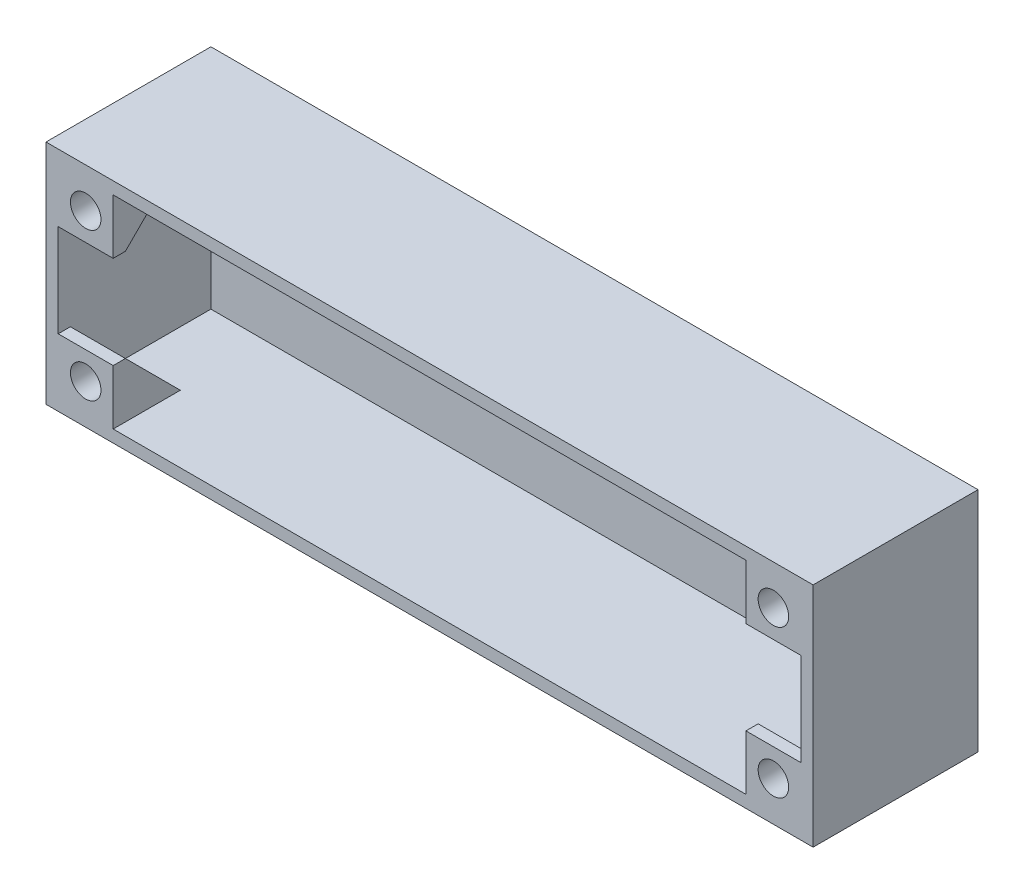
ISO-10303-21;
HEADER;
FILE_DESCRIPTION(('STEP AP214'),'2;1');
FILE_NAME('part.step','',(''),(''),'','','');
FILE_SCHEMA(('AUTOMOTIVE_DESIGN { 1 0 10303 214 1 1 1 1 }'));
ENDSEC;
DATA;
#1=APPLICATION_CONTEXT('core data for automotive mechanical design processes');
#2=APPLICATION_PROTOCOL_DEFINITION('international standard','automotive_design',2000,#1);
#3=PRODUCT_CONTEXT('',#1,'mechanical');
#4=PRODUCT('Part','Part','',(#3));
#5=PRODUCT_RELATED_PRODUCT_CATEGORY('part','',(#4));
#6=PRODUCT_DEFINITION_FORMATION('','',#4);
#7=PRODUCT_DEFINITION_CONTEXT('part definition',#1,'design');
#8=PRODUCT_DEFINITION('design','',#6,#7);
#9=PRODUCT_DEFINITION_SHAPE('','',#8);
#10=(LENGTH_UNIT() NAMED_UNIT(*) SI_UNIT(.MILLI.,.METRE.));
#11=(NAMED_UNIT(*) PLANE_ANGLE_UNIT() SI_UNIT($,.RADIAN.));
#12=(NAMED_UNIT(*) SI_UNIT($,.STERADIAN.) SOLID_ANGLE_UNIT());
#13=UNCERTAINTY_MEASURE_WITH_UNIT(LENGTH_MEASURE(1.E-05),#10,'distance_accuracy_value','');
#14=(GEOMETRIC_REPRESENTATION_CONTEXT(3) GLOBAL_UNCERTAINTY_ASSIGNED_CONTEXT((#13)) GLOBAL_UNIT_ASSIGNED_CONTEXT((#10,
#11,#12)) REPRESENTATION_CONTEXT('',''));
#15=CARTESIAN_POINT('',(0.,0.,0.));
#16=DIRECTION('',(0.,0.,1.));
#17=DIRECTION('',(1.,0.,0.));
#18=AXIS2_PLACEMENT_3D('',#15,#16,#17);
#19=CARTESIAN_POINT('',(0.,0.,-81.3976969654658));
#20=DIRECTION('',(0.,0.,-1.));
#21=DIRECTION('',(-1.,0.,0.));
#22=AXIS2_PLACEMENT_3D('',#19,#20,#21);
#23=PLANE('',#22);
#24=CARTESIAN_POINT('',(90.9030782776469,105.238059859203,-81.3976969654658));
#25=DIRECTION('',(0.,0.,1.));
#26=DIRECTION('',(1.,0.,0.));
#27=AXIS2_PLACEMENT_3D('',#24,#25,#26);
#28=CIRCLE('',#27,2.50000000000001);
#29=CARTESIAN_POINT('',(93.4030782776469,105.238059859203,-81.3976969654658));
#30=VERTEX_POINT('',#29);
#31=EDGE_CURVE('E725',#30,#30,#28,.T.);
#32=ORIENTED_EDGE('',*,*,#31,.F.);
#33=EDGE_LOOP('',(#32));
#34=FACE_BOUND('',#33,.T.);
#35=CARTESIAN_POINT('',(90.9030782776469,81.0380598592033,-81.3976969654658));
#36=DIRECTION('',(0.,0.,1.));
#37=DIRECTION('',(1.,0.,0.));
#38=AXIS2_PLACEMENT_3D('',#35,#36,#37);
#39=CIRCLE('',#38,2.50000000000001);
#40=CARTESIAN_POINT('',(93.4030782776469,81.0380598592033,-81.3976969654658));
#41=VERTEX_POINT('',#40);
#42=EDGE_CURVE('E727',#41,#41,#39,.T.);
#43=ORIENTED_EDGE('',*,*,#42,.F.);
#44=EDGE_LOOP('',(#43));
#45=FACE_BOUND('',#44,.T.);
#46=CARTESIAN_POINT('',(-21.6969217223531,81.0380598592034,-81.3976969654658));
#47=DIRECTION('',(0.,0.,1.));
#48=DIRECTION('',(1.,0.,0.));
#49=AXIS2_PLACEMENT_3D('',#46,#47,#48);
#50=CIRCLE('',#49,2.5);
#51=CARTESIAN_POINT('',(-19.1969217223531,81.0380598592034,-81.3976969654658));
#52=VERTEX_POINT('',#51);
#53=EDGE_CURVE('E730',#52,#52,#50,.T.);
#54=ORIENTED_EDGE('',*,*,#53,.F.);
#55=EDGE_LOOP('',(#54));
#56=FACE_BOUND('',#55,.T.);
#57=CARTESIAN_POINT('',(-21.6969217223531,105.238059859203,-81.3976969654658));
#58=DIRECTION('',(0.,0.,1.));
#59=DIRECTION('',(1.,0.,0.));
#60=AXIS2_PLACEMENT_3D('',#57,#58,#59);
#61=CIRCLE('',#60,2.5);
#62=CARTESIAN_POINT('',(-19.1969217223531,105.238059859203,-81.3976969654658));
#63=VERTEX_POINT('',#62);
#64=EDGE_CURVE('E220',#63,#63,#61,.T.);
#65=ORIENTED_EDGE('',*,*,#64,.F.);
#66=EDGE_LOOP('',(#65));
#67=FACE_BOUND('',#66,.T.);
#68=DIRECTION('',(-1.,0.,0.));
#69=VECTOR('',#68,1.);
#70=CARTESIAN_POINT('',(-26.1969217223531,76.5380598592034,-81.3976969654658));
#71=LINE('',#70,#69);
#72=CARTESIAN_POINT('',(86.4030782776469,76.5380598592034,-81.3976969654658));
#73=VERTEX_POINT('',#72);
#74=CARTESIAN_POINT('',(-17.1969217223531,76.5380598592034,-81.3976969654658));
#75=VERTEX_POINT('',#74);
#76=EDGE_CURVE('E303',#73,#75,#71,.T.);
#77=ORIENTED_EDGE('',*,*,#76,.T.);
#78=DIRECTION('',(0.,1.,0.));
#79=VECTOR('',#78,1.);
#80=CARTESIAN_POINT('',(-17.1969217223531,76.5380598592034,-81.3976969654658));
#81=LINE('',#80,#79);
#82=CARTESIAN_POINT('',(-17.1969217223531,85.5380598592034,-81.3976969654658));
#83=VERTEX_POINT('',#82);
#84=EDGE_CURVE('E216',#75,#83,#81,.T.);
#85=ORIENTED_EDGE('',*,*,#84,.T.);
#86=DIRECTION('',(-1.,0.,0.));
#87=VECTOR('',#86,1.);
#88=CARTESIAN_POINT('',(-26.1969217223531,85.5380598592034,-81.3976969654658));
#89=LINE('',#88,#87);
#90=CARTESIAN_POINT('',(-26.1969217223531,85.5380598592034,-81.3976969654658));
#91=VERTEX_POINT('',#90);
#92=EDGE_CURVE('E204',#83,#91,#89,.T.);
#93=ORIENTED_EDGE('',*,*,#92,.T.);
#94=DIRECTION('',(0.,1.,0.));
#95=VECTOR('',#94,1.);
#96=CARTESIAN_POINT('',(-26.1969217223531,76.5380598592034,-81.3976969654658));
#97=LINE('',#96,#95);
#98=CARTESIAN_POINT('',(-26.1969217223531,100.738059859203,-81.3976969654658));
#99=VERTEX_POINT('',#98);
#100=EDGE_CURVE('E325',#91,#99,#97,.T.);
#101=ORIENTED_EDGE('',*,*,#100,.T.);
#102=DIRECTION('',(1.,0.,0.));
#103=VECTOR('',#102,1.);
#104=CARTESIAN_POINT('',(-26.1969217223531,100.738059859203,-81.3976969654658));
#105=LINE('',#104,#103);
#106=CARTESIAN_POINT('',(-17.1969217223531,100.738059859203,-81.3976969654658));
#107=VERTEX_POINT('',#106);
#108=EDGE_CURVE('E225',#99,#107,#105,.T.);
#109=ORIENTED_EDGE('',*,*,#108,.T.);
#110=DIRECTION('',(0.,1.,0.));
#111=VECTOR('',#110,1.);
#112=CARTESIAN_POINT('',(-17.1969217223531,109.738059859203,-81.3976969654658));
#113=LINE('',#112,#111);
#114=CARTESIAN_POINT('',(-17.1969217223531,109.738059859203,-81.3976969654658));
#115=VERTEX_POINT('',#114);
#116=EDGE_CURVE('E232',#107,#115,#113,.T.);
#117=ORIENTED_EDGE('',*,*,#116,.T.);
#118=DIRECTION('',(1.,0.,0.));
#119=VECTOR('',#118,1.);
#120=CARTESIAN_POINT('',(-26.1969217223531,109.738059859203,-81.3976969654658));
#121=LINE('',#120,#119);
#122=CARTESIAN_POINT('',(86.4030782776469,109.738059859203,-81.3976969654658));
#123=VERTEX_POINT('',#122);
#124=EDGE_CURVE('E328',#115,#123,#121,.T.);
#125=ORIENTED_EDGE('',*,*,#124,.T.);
#126=DIRECTION('',(0.,-1.,0.));
#127=VECTOR('',#126,1.);
#128=CARTESIAN_POINT('',(86.4030782776469,109.738059859203,-81.3976969654658));
#129=LINE('',#128,#127);
#130=CARTESIAN_POINT('',(86.4030782776469,100.738059859203,-81.3976969654658));
#131=VERTEX_POINT('',#130);
#132=EDGE_CURVE('E262',#123,#131,#129,.T.);
#133=ORIENTED_EDGE('',*,*,#132,.T.);
#134=DIRECTION('',(1.,0.,0.));
#135=VECTOR('',#134,1.);
#136=CARTESIAN_POINT('',(95.4030782776469,100.738059859203,-81.3976969654658));
#137=LINE('',#136,#135);
#138=CARTESIAN_POINT('',(95.4030782776469,100.738059859203,-81.3976969654658));
#139=VERTEX_POINT('',#138);
#140=EDGE_CURVE('E272',#131,#139,#137,.T.);
#141=ORIENTED_EDGE('',*,*,#140,.T.);
#142=DIRECTION('',(0.,-1.,0.));
#143=VECTOR('',#142,1.);
#144=CARTESIAN_POINT('',(95.4030782776469,76.5380598592034,-81.3976969654658));
#145=LINE('',#144,#143);
#146=CARTESIAN_POINT('',(95.4030782776469,85.5380598592033,-81.3976969654658));
#147=VERTEX_POINT('',#146);
#148=EDGE_CURVE('E309',#139,#147,#145,.T.);
#149=ORIENTED_EDGE('',*,*,#148,.T.);
#150=DIRECTION('',(-1.,0.,0.));
#151=VECTOR('',#150,1.);
#152=CARTESIAN_POINT('',(95.4030782776469,85.5380598592033,-81.3976969654658));
#153=LINE('',#152,#151);
#154=CARTESIAN_POINT('',(86.4030782776469,85.5380598592033,-81.3976969654658));
#155=VERTEX_POINT('',#154);
#156=EDGE_CURVE('E240',#147,#155,#153,.T.);
#157=ORIENTED_EDGE('',*,*,#156,.T.);
#158=DIRECTION('',(0.,-1.,0.));
#159=VECTOR('',#158,1.);
#160=CARTESIAN_POINT('',(86.4030782776469,76.5380598592034,-81.3976969654658));
#161=LINE('',#160,#159);
#162=EDGE_CURVE('E252',#155,#73,#161,.T.);
#163=ORIENTED_EDGE('',*,*,#162,.T.);
#164=EDGE_LOOP('',(#77,#85,#93,#101,#109,#117,#125,#133,#141,#149,#157,#163));
#165=FACE_BOUND('',#164,.T.);
#166=DIRECTION('',(0.,1.,0.));
#167=VECTOR('',#166,1.);
#168=CARTESIAN_POINT('',(-28.1969217223531,74.5380598592034,-81.3976969654658));
#169=LINE('',#168,#167);
#170=CARTESIAN_POINT('',(-28.1969217223531,74.5380598592034,-81.3976969654658));
#171=VERTEX_POINT('',#170);
#172=CARTESIAN_POINT('',(-28.1969217223531,111.738059859203,-81.3976969654658));
#173=VERTEX_POINT('',#172);
#174=EDGE_CURVE('E349',#171,#173,#169,.T.);
#175=ORIENTED_EDGE('',*,*,#174,.F.);
#176=DIRECTION('',(-1.,0.,0.));
#177=VECTOR('',#176,1.);
#178=CARTESIAN_POINT('',(-28.1969217223531,74.5380598592034,-81.3976969654658));
#179=LINE('',#178,#177);
#180=CARTESIAN_POINT('',(97.4030782776469,74.5380598592034,-81.3976969654658));
#181=VERTEX_POINT('',#180);
#182=EDGE_CURVE('E359',#181,#171,#179,.T.);
#183=ORIENTED_EDGE('',*,*,#182,.F.);
#184=DIRECTION('',(0.,-1.,0.));
#185=VECTOR('',#184,1.);
#186=CARTESIAN_POINT('',(97.4030782776469,74.5380598592034,-81.3976969654658));
#187=LINE('',#186,#185);
#188=CARTESIAN_POINT('',(97.4030782776469,111.738059859203,-81.3976969654658));
#189=VERTEX_POINT('',#188);
#190=EDGE_CURVE('E356',#189,#181,#187,.T.);
#191=ORIENTED_EDGE('',*,*,#190,.F.);
#192=DIRECTION('',(1.,0.,0.));
#193=VECTOR('',#192,1.);
#194=CARTESIAN_POINT('',(-28.1969217223531,111.738059859203,-81.3976969654658));
#195=LINE('',#194,#193);
#196=EDGE_CURVE('E353',#173,#189,#195,.T.);
#197=ORIENTED_EDGE('',*,*,#196,.F.);
#198=EDGE_LOOP('',(#175,#183,#191,#197));
#199=FACE_BOUND('',#198,.T.);
#200=ADVANCED_FACE('F41',(#34,#45,#56,#67,#165,#199),#23,.F.);
#201=CARTESIAN_POINT('',(-28.1969217223531,74.5380598592034,-106.397696965466));
#202=DIRECTION('',(1.,0.,0.));
#203=DIRECTION('',(0.,0.,-1.));
#204=AXIS2_PLACEMENT_3D('',#201,#202,#203);
#205=PLANE('',#204);
#206=ORIENTED_EDGE('',*,*,#174,.T.);
#207=DIRECTION('',(0.,0.,1.));
#208=VECTOR('',#207,1.);
#209=CARTESIAN_POINT('',(-28.1969217223531,111.738059859203,-106.397696965466));
#210=LINE('',#209,#208);
#211=CARTESIAN_POINT('',(-28.1969217223531,111.738059859203,-108.397696965466));
#212=VERTEX_POINT('',#211);
#213=EDGE_CURVE('E374',#212,#173,#210,.T.);
#214=ORIENTED_EDGE('',*,*,#213,.F.);
#215=DIRECTION('',(0.,1.,0.));
#216=VECTOR('',#215,1.);
#217=CARTESIAN_POINT('',(-28.1969217223531,74.5380598592034,-108.397696965466));
#218=LINE('',#217,#216);
#219=CARTESIAN_POINT('',(-28.1969217223531,74.5380598592034,-108.397696965466));
#220=VERTEX_POINT('',#219);
#221=EDGE_CURVE('E295',#220,#212,#218,.T.);
#222=ORIENTED_EDGE('',*,*,#221,.F.);
#223=DIRECTION('',(0.,0.,1.));
#224=VECTOR('',#223,1.);
#225=CARTESIAN_POINT('',(-28.1969217223531,74.5380598592034,-106.397696965466));
#226=LINE('',#225,#224);
#227=EDGE_CURVE('E362',#220,#171,#226,.T.);
#228=ORIENTED_EDGE('',*,*,#227,.T.);
#229=EDGE_LOOP('',(#206,#214,#222,#228));
#230=FACE_BOUND('',#229,.T.);
#231=ADVANCED_FACE('F437',(#230),#205,.F.);
#232=CARTESIAN_POINT('',(-28.1969217223531,111.738059859203,-106.397696965466));
#233=DIRECTION('',(0.,-1.,0.));
#234=DIRECTION('',(1.,0.,0.));
#235=AXIS2_PLACEMENT_3D('',#232,#233,#234);
#236=PLANE('',#235);
#237=ORIENTED_EDGE('',*,*,#196,.T.);
#238=DIRECTION('',(0.,0.,1.));
#239=VECTOR('',#238,1.);
#240=CARTESIAN_POINT('',(97.4030782776469,111.738059859203,-106.397696965466));
#241=LINE('',#240,#239);
#242=CARTESIAN_POINT('',(97.4030782776469,111.738059859203,-108.397696965466));
#243=VERTEX_POINT('',#242);
#244=EDGE_CURVE('E370',#243,#189,#241,.T.);
#245=ORIENTED_EDGE('',*,*,#244,.F.);
#246=DIRECTION('',(1.,0.,0.));
#247=VECTOR('',#246,1.);
#248=CARTESIAN_POINT('',(97.4030782776469,111.738059859203,-108.397696965466));
#249=LINE('',#248,#247);
#250=EDGE_CURVE('E299',#212,#243,#249,.T.);
#251=ORIENTED_EDGE('',*,*,#250,.F.);
#252=ORIENTED_EDGE('',*,*,#213,.T.);
#253=EDGE_LOOP('',(#237,#245,#251,#252));
#254=FACE_BOUND('',#253,.T.);
#255=ADVANCED_FACE('F443',(#254),#236,.F.);
#256=CARTESIAN_POINT('',(97.4030782776469,74.5380598592034,-106.397696965466));
#257=DIRECTION('',(-1.,0.,0.));
#258=DIRECTION('',(0.,0.,1.));
#259=AXIS2_PLACEMENT_3D('',#256,#257,#258);
#260=PLANE('',#259);
#261=ORIENTED_EDGE('',*,*,#190,.T.);
#262=DIRECTION('',(0.,0.,1.));
#263=VECTOR('',#262,1.);
#264=CARTESIAN_POINT('',(97.4030782776469,74.5380598592034,-106.397696965466));
#265=LINE('',#264,#263);
#266=CARTESIAN_POINT('',(97.4030782776469,74.5380598592034,-108.397696965466));
#267=VERTEX_POINT('',#266);
#268=EDGE_CURVE('E366',#267,#181,#265,.T.);
#269=ORIENTED_EDGE('',*,*,#268,.F.);
#270=DIRECTION('',(0.,-1.,0.));
#271=VECTOR('',#270,1.);
#272=CARTESIAN_POINT('',(97.4030782776469,74.5380598592034,-108.397696965466));
#273=LINE('',#272,#271);
#274=EDGE_CURVE('E282',#243,#267,#273,.T.);
#275=ORIENTED_EDGE('',*,*,#274,.F.);
#276=ORIENTED_EDGE('',*,*,#244,.T.);
#277=EDGE_LOOP('',(#261,#269,#275,#276));
#278=FACE_BOUND('',#277,.T.);
#279=ADVANCED_FACE('F455',(#278),#260,.F.);
#280=CARTESIAN_POINT('',(-28.1969217223531,74.5380598592034,-106.397696965466));
#281=DIRECTION('',(0.,1.,0.));
#282=DIRECTION('',(-1.,0.,0.));
#283=AXIS2_PLACEMENT_3D('',#280,#281,#282);
#284=PLANE('',#283);
#285=ORIENTED_EDGE('',*,*,#182,.T.);
#286=ORIENTED_EDGE('',*,*,#227,.F.);
#287=DIRECTION('',(-1.,0.,0.));
#288=VECTOR('',#287,1.);
#289=CARTESIAN_POINT('',(97.4030782776469,74.5380598592034,-108.397696965466));
#290=LINE('',#289,#288);
#291=EDGE_CURVE('E291',#267,#220,#290,.T.);
#292=ORIENTED_EDGE('',*,*,#291,.F.);
#293=ORIENTED_EDGE('',*,*,#268,.T.);
#294=EDGE_LOOP('',(#285,#286,#292,#293));
#295=FACE_BOUND('',#294,.T.);
#296=ADVANCED_FACE('F452',(#295),#284,.F.);
#297=CARTESIAN_POINT('',(-26.1969217223531,76.5380598592034,-106.397696965466));
#298=DIRECTION('',(0.,1.,0.));
#299=DIRECTION('',(-1.,0.,0.));
#300=AXIS2_PLACEMENT_3D('',#297,#298,#299);
#301=PLANE('',#300);
#302=DIRECTION('',(0.,0.,1.));
#303=VECTOR('',#302,1.);
#304=CARTESIAN_POINT('',(-26.1969217223531,76.5380598592034,-106.397696965466));
#305=LINE('',#304,#303);
#306=CARTESIAN_POINT('',(-26.1969217223531,76.5380598592034,-106.397696965466));
#307=VERTEX_POINT('',#306);
#308=CARTESIAN_POINT('',(-26.1969217223531,76.5380598592034,-92.3976969654658));
#309=VERTEX_POINT('',#308);
#310=EDGE_CURVE('E345',#307,#309,#305,.T.);
#311=ORIENTED_EDGE('',*,*,#310,.T.);
#312=DIRECTION('',(1.,0.,0.));
#313=VECTOR('',#312,1.);
#314=CARTESIAN_POINT('',(-17.1969217223531,76.5380598592034,-92.3976969654658));
#315=LINE('',#314,#313);
#316=CARTESIAN_POINT('',(-17.1969217223531,76.5380598592034,-92.3976969654658));
#317=VERTEX_POINT('',#316);
#318=EDGE_CURVE('E382',#309,#317,#315,.T.);
#319=ORIENTED_EDGE('',*,*,#318,.T.);
#320=DIRECTION('',(0.,0.,1.));
#321=VECTOR('',#320,1.);
#322=CARTESIAN_POINT('',(-17.1969217223531,76.5380598592034,-83.3976969654658));
#323=LINE('',#322,#321);
#324=EDGE_CURVE('E189',#317,#75,#323,.T.);
#325=ORIENTED_EDGE('',*,*,#324,.T.);
#326=ORIENTED_EDGE('',*,*,#76,.F.);
#327=DIRECTION('',(0.,0.,1.));
#328=VECTOR('',#327,1.);
#329=CARTESIAN_POINT('',(86.4030782776469,76.5380598592034,-83.3976969654658));
#330=LINE('',#329,#328);
#331=CARTESIAN_POINT('',(86.4030782776469,76.5380598592034,-92.3976969654658));
#332=VERTEX_POINT('',#331);
#333=EDGE_CURVE('E259',#332,#73,#330,.T.);
#334=ORIENTED_EDGE('',*,*,#333,.F.);
#335=DIRECTION('',(1.,0.,0.));
#336=VECTOR('',#335,1.);
#337=CARTESIAN_POINT('',(-26.1969217223531,76.5380598592034,-92.3976969654658));
#338=LINE('',#337,#336);
#339=CARTESIAN_POINT('',(95.4030782776469,76.5380598592034,-92.3976969654658));
#340=VERTEX_POINT('',#339);
#341=EDGE_CURVE('E378',#332,#340,#338,.T.);
#342=ORIENTED_EDGE('',*,*,#341,.T.);
#343=DIRECTION('',(0.,0.,1.));
#344=VECTOR('',#343,1.);
#345=CARTESIAN_POINT('',(95.4030782776469,76.5380598592034,-106.397696965466));
#346=LINE('',#345,#344);
#347=CARTESIAN_POINT('',(95.4030782776469,76.5380598592034,-106.397696965466));
#348=VERTEX_POINT('',#347);
#349=EDGE_CURVE('E321',#348,#340,#346,.T.);
#350=ORIENTED_EDGE('',*,*,#349,.F.);
#351=DIRECTION('',(-1.,0.,0.));
#352=VECTOR('',#351,1.);
#353=CARTESIAN_POINT('',(-26.1969217223531,76.5380598592034,-106.397696965466));
#354=LINE('',#353,#352);
#355=EDGE_CURVE('E304',#348,#307,#354,.T.);
#356=ORIENTED_EDGE('',*,*,#355,.T.);
#357=EDGE_LOOP('',(#311,#319,#325,#326,#334,#342,#350,#356));
#358=FACE_BOUND('',#357,.T.);
#359=ADVANCED_FACE('F450',(#358),#301,.T.);
#360=CARTESIAN_POINT('',(-26.1969217223531,76.5380598592034,-106.397696965466));
#361=DIRECTION('',(1.,0.,0.));
#362=DIRECTION('',(0.,0.,-1.));
#363=AXIS2_PLACEMENT_3D('',#360,#361,#362);
#364=PLANE('',#363);
#365=DIRECTION('',(0.,0.,1.));
#366=VECTOR('',#365,1.);
#367=CARTESIAN_POINT('',(-26.1969217223531,85.5380598592034,-83.3976969654658));
#368=LINE('',#367,#366);
#369=CARTESIAN_POINT('',(-26.1969217223531,85.5380598592034,-83.3976969654658));
#370=VERTEX_POINT('',#369);
#371=EDGE_CURVE('E206',#370,#91,#368,.T.);
#372=ORIENTED_EDGE('',*,*,#371,.F.);
#373=DIRECTION('',(0.,0.707106781186544,0.707106781186551));
#374=VECTOR('',#373,1.);
#375=CARTESIAN_POINT('',(-26.1969217223531,69.5380598592034,-99.3976969654659));
#376=LINE('',#375,#374);
#377=EDGE_CURVE('E210',#370,#309,#376,.F.);
#378=ORIENTED_EDGE('',*,*,#377,.T.);
#379=ORIENTED_EDGE('',*,*,#310,.F.);
#380=DIRECTION('',(0.,1.,0.));
#381=VECTOR('',#380,1.);
#382=CARTESIAN_POINT('',(-26.1969217223531,76.5380598592034,-106.397696965466));
#383=LINE('',#382,#381);
#384=CARTESIAN_POINT('',(-26.1969217223531,109.738059859203,-106.397696965466));
#385=VERTEX_POINT('',#384);
#386=EDGE_CURVE('E308',#307,#385,#383,.T.);
#387=ORIENTED_EDGE('',*,*,#386,.T.);
#388=DIRECTION('',(0.,0.,1.));
#389=VECTOR('',#388,1.);
#390=CARTESIAN_POINT('',(-26.1969217223531,109.738059859203,-106.397696965466));
#391=LINE('',#390,#389);
#392=CARTESIAN_POINT('',(-26.1969217223531,109.738059859203,-92.3976969654658));
#393=VERTEX_POINT('',#392);
#394=EDGE_CURVE('E341',#385,#393,#391,.T.);
#395=ORIENTED_EDGE('',*,*,#394,.T.);
#396=DIRECTION('',(0.,-0.707106781186544,0.707106781186551));
#397=VECTOR('',#396,1.);
#398=CARTESIAN_POINT('',(-26.1969217223531,100.138059859204,-82.7976969654658));
#399=LINE('',#398,#397);
#400=CARTESIAN_POINT('',(-26.1969217223531,100.738059859203,-83.3976969654658));
#401=VERTEX_POINT('',#400);
#402=EDGE_CURVE('E385',#393,#401,#399,.T.);
#403=ORIENTED_EDGE('',*,*,#402,.T.);
#404=DIRECTION('',(0.,0.,1.));
#405=VECTOR('',#404,1.);
#406=CARTESIAN_POINT('',(-26.1969217223531,100.738059859203,-83.3976969654658));
#407=LINE('',#406,#405);
#408=EDGE_CURVE('E231',#401,#99,#407,.T.);
#409=ORIENTED_EDGE('',*,*,#408,.T.);
#410=ORIENTED_EDGE('',*,*,#100,.F.);
#411=EDGE_LOOP('',(#372,#378,#379,#387,#395,#403,#409,#410));
#412=FACE_BOUND('',#411,.T.);
#413=ADVANCED_FACE('F500',(#412),#364,.T.);
#414=CARTESIAN_POINT('',(-26.1969217223531,109.738059859203,-106.397696965466));
#415=DIRECTION('',(0.,-1.,0.));
#416=DIRECTION('',(1.,0.,0.));
#417=AXIS2_PLACEMENT_3D('',#414,#415,#416);
#418=PLANE('',#417);
#419=DIRECTION('',(0.,0.,1.));
#420=VECTOR('',#419,1.);
#421=CARTESIAN_POINT('',(95.4030782776469,109.738059859203,-106.397696965466));
#422=LINE('',#421,#420);
#423=CARTESIAN_POINT('',(95.4030782776469,109.738059859203,-106.397696965466));
#424=VERTEX_POINT('',#423);
#425=CARTESIAN_POINT('',(95.4030782776469,109.738059859203,-92.3976969654658));
#426=VERTEX_POINT('',#425);
#427=EDGE_CURVE('E337',#424,#426,#422,.T.);
#428=ORIENTED_EDGE('',*,*,#427,.T.);
#429=DIRECTION('',(-1.,0.,0.));
#430=VECTOR('',#429,1.);
#431=CARTESIAN_POINT('',(86.4030782776469,109.738059859203,-92.3976969654658));
#432=LINE('',#431,#430);
#433=CARTESIAN_POINT('',(86.4030782776469,109.738059859203,-92.3976969654658));
#434=VERTEX_POINT('',#433);
#435=EDGE_CURVE('E196',#426,#434,#432,.T.);
#436=ORIENTED_EDGE('',*,*,#435,.T.);
#437=DIRECTION('',(0.,0.,1.));
#438=VECTOR('',#437,1.);
#439=CARTESIAN_POINT('',(86.4030782776469,109.738059859203,-83.3976969654658));
#440=LINE('',#439,#438);
#441=EDGE_CURVE('E60',#434,#123,#440,.T.);
#442=ORIENTED_EDGE('',*,*,#441,.T.);
#443=ORIENTED_EDGE('',*,*,#124,.F.);
#444=DIRECTION('',(0.,0.,1.));
#445=VECTOR('',#444,1.);
#446=CARTESIAN_POINT('',(-17.1969217223531,109.738059859203,-83.3976969654658));
#447=LINE('',#446,#445);
#448=CARTESIAN_POINT('',(-17.1969217223531,109.738059859203,-92.3976969654658));
#449=VERTEX_POINT('',#448);
#450=EDGE_CURVE('E68',#449,#115,#447,.T.);
#451=ORIENTED_EDGE('',*,*,#450,.F.);
#452=DIRECTION('',(-1.,0.,0.));
#453=VECTOR('',#452,1.);
#454=CARTESIAN_POINT('',(-26.1969217223531,109.738059859203,-92.3976969654658));
#455=LINE('',#454,#453);
#456=EDGE_CURVE('E396',#449,#393,#455,.T.);
#457=ORIENTED_EDGE('',*,*,#456,.T.);
#458=ORIENTED_EDGE('',*,*,#394,.F.);
#459=DIRECTION('',(1.,0.,0.));
#460=VECTOR('',#459,1.);
#461=CARTESIAN_POINT('',(-26.1969217223531,109.738059859203,-106.397696965466));
#462=LINE('',#461,#460);
#463=EDGE_CURVE('E313',#385,#424,#462,.T.);
#464=ORIENTED_EDGE('',*,*,#463,.T.);
#465=EDGE_LOOP('',(#428,#436,#442,#443,#451,#457,#458,#464));
#466=FACE_BOUND('',#465,.T.);
#467=ADVANCED_FACE('F494',(#466),#418,.T.);
#468=CARTESIAN_POINT('',(95.4030782776469,76.5380598592034,-106.397696965466));
#469=DIRECTION('',(-1.,0.,0.));
#470=DIRECTION('',(0.,0.,1.));
#471=AXIS2_PLACEMENT_3D('',#468,#469,#470);
#472=PLANE('',#471);
#473=ORIENTED_EDGE('',*,*,#349,.T.);
#474=DIRECTION('',(0.,0.707106781186544,0.707106781186551));
#475=VECTOR('',#474,1.);
#476=CARTESIAN_POINT('',(95.4030782776469,69.5380598592034,-99.3976969654659));
#477=LINE('',#476,#475);
#478=CARTESIAN_POINT('',(95.4030782776469,85.5380598592033,-83.3976969654658));
#479=VERTEX_POINT('',#478);
#480=EDGE_CURVE('E393',#340,#479,#477,.T.);
#481=ORIENTED_EDGE('',*,*,#480,.T.);
#482=DIRECTION('',(0.,0.,1.));
#483=VECTOR('',#482,1.);
#484=CARTESIAN_POINT('',(95.4030782776469,85.5380598592033,-83.3976969654658));
#485=LINE('',#484,#483);
#486=EDGE_CURVE('E251',#479,#147,#485,.T.);
#487=ORIENTED_EDGE('',*,*,#486,.T.);
#488=ORIENTED_EDGE('',*,*,#148,.F.);
#489=DIRECTION('',(0.,0.,1.));
#490=VECTOR('',#489,1.);
#491=CARTESIAN_POINT('',(95.4030782776469,100.738059859203,-83.3976969654658));
#492=LINE('',#491,#490);
#493=CARTESIAN_POINT('',(95.4030782776469,100.738059859203,-83.3976969654658));
#494=VERTEX_POINT('',#493);
#495=EDGE_CURVE('E278',#494,#139,#492,.T.);
#496=ORIENTED_EDGE('',*,*,#495,.F.);
#497=DIRECTION('',(0.,-0.707106781186544,0.707106781186551));
#498=VECTOR('',#497,1.);
#499=CARTESIAN_POINT('',(95.4030782776469,100.138059859204,-82.7976969654658));
#500=LINE('',#499,#498);
#501=EDGE_CURVE('E390',#494,#426,#500,.F.);
#502=ORIENTED_EDGE('',*,*,#501,.T.);
#503=ORIENTED_EDGE('',*,*,#427,.F.);
#504=DIRECTION('',(0.,-1.,0.));
#505=VECTOR('',#504,1.);
#506=CARTESIAN_POINT('',(95.4030782776469,76.5380598592034,-106.397696965466));
#507=LINE('',#506,#505);
#508=EDGE_CURVE('E317',#424,#348,#507,.T.);
#509=ORIENTED_EDGE('',*,*,#508,.T.);
#510=EDGE_LOOP('',(#473,#481,#487,#488,#496,#502,#503,#509));
#511=FACE_BOUND('',#510,.T.);
#512=ADVANCED_FACE('F492',(#511),#472,.T.);
#513=CARTESIAN_POINT('',(0.,0.,-106.397696965466));
#514=DIRECTION('',(0.,0.,1.));
#515=DIRECTION('',(1.,0.,0.));
#516=AXIS2_PLACEMENT_3D('',#513,#514,#515);
#517=PLANE('',#516);
#518=ORIENTED_EDGE('',*,*,#386,.F.);
#519=ORIENTED_EDGE('',*,*,#355,.F.);
#520=ORIENTED_EDGE('',*,*,#508,.F.);
#521=ORIENTED_EDGE('',*,*,#463,.F.);
#522=EDGE_LOOP('',(#518,#519,#520,#521));
#523=FACE_BOUND('',#522,.T.);
#524=ADVANCED_FACE('F497',(#523),#517,.T.);
#525=CARTESIAN_POINT('',(0.,0.,-108.397696965466));
#526=DIRECTION('',(0.,0.,1.));
#527=DIRECTION('',(1.,0.,0.));
#528=AXIS2_PLACEMENT_3D('',#525,#526,#527);
#529=PLANE('',#528);
#530=ORIENTED_EDGE('',*,*,#274,.T.);
#531=ORIENTED_EDGE('',*,*,#291,.T.);
#532=ORIENTED_EDGE('',*,*,#221,.T.);
#533=ORIENTED_EDGE('',*,*,#250,.T.);
#534=EDGE_LOOP('',(#530,#531,#532,#533));
#535=FACE_BOUND('',#534,.T.);
#536=ADVANCED_FACE('F549',(#535),#529,.F.);
#537=CARTESIAN_POINT('',(95.4030782776469,100.738059859203,-83.3976969654658));
#538=DIRECTION('',(0.,-1.,0.));
#539=DIRECTION('',(0.,0.,-1.));
#540=AXIS2_PLACEMENT_3D('',#537,#538,#539);
#541=PLANE('',#540);
#542=ORIENTED_EDGE('',*,*,#140,.F.);
#543=DIRECTION('',(0.,0.,1.));
#544=VECTOR('',#543,1.);
#545=CARTESIAN_POINT('',(86.4030782776469,100.738059859203,-83.3976969654658));
#546=LINE('',#545,#544);
#547=CARTESIAN_POINT('',(86.4030782776469,100.738059859203,-83.3976969654658));
#548=VERTEX_POINT('',#547);
#549=EDGE_CURVE('E283',#548,#131,#546,.T.);
#550=ORIENTED_EDGE('',*,*,#549,.F.);
#551=DIRECTION('',(1.,0.,0.));
#552=VECTOR('',#551,1.);
#553=CARTESIAN_POINT('',(95.4030782776469,100.738059859203,-83.3976969654658));
#554=LINE('',#553,#552);
#555=EDGE_CURVE('E269',#548,#494,#554,.T.);
#556=ORIENTED_EDGE('',*,*,#555,.T.);
#557=ORIENTED_EDGE('',*,*,#495,.T.);
#558=EDGE_LOOP('',(#542,#550,#556,#557));
#559=FACE_BOUND('',#558,.T.);
#560=ADVANCED_FACE('F519',(#559),#541,.T.);
#561=CARTESIAN_POINT('',(86.4030782776469,109.738059859203,-83.3976969654658));
#562=DIRECTION('',(-1.,0.,0.));
#563=DIRECTION('',(0.,0.,1.));
#564=AXIS2_PLACEMENT_3D('',#561,#562,#563);
#565=PLANE('',#564);
#566=ORIENTED_EDGE('',*,*,#132,.F.);
#567=ORIENTED_EDGE('',*,*,#441,.F.);
#568=DIRECTION('',(0.,0.707106781186544,-0.707106781186551));
#569=VECTOR('',#568,1.);
#570=CARTESIAN_POINT('',(86.4030782776469,109.738059859203,-92.3976969654658));
#571=LINE('',#570,#569);
#572=EDGE_CURVE('E52',#434,#548,#571,.F.);
#573=ORIENTED_EDGE('',*,*,#572,.T.);
#574=ORIENTED_EDGE('',*,*,#549,.T.);
#575=EDGE_LOOP('',(#566,#567,#573,#574));
#576=FACE_BOUND('',#575,.T.);
#577=ADVANCED_FACE('F520',(#576),#565,.T.);
#578=CARTESIAN_POINT('',(86.4030782776469,76.5380598592034,-83.3976969654658));
#579=DIRECTION('',(-1.,0.,0.));
#580=DIRECTION('',(0.,0.,1.));
#581=AXIS2_PLACEMENT_3D('',#578,#579,#580);
#582=PLANE('',#581);
#583=ORIENTED_EDGE('',*,*,#162,.F.);
#584=DIRECTION('',(0.,0.,1.));
#585=VECTOR('',#584,1.);
#586=CARTESIAN_POINT('',(86.4030782776469,85.5380598592033,-83.3976969654658));
#587=LINE('',#586,#585);
#588=CARTESIAN_POINT('',(86.4030782776469,85.5380598592033,-83.3976969654658));
#589=VERTEX_POINT('',#588);
#590=EDGE_CURVE('E263',#589,#155,#587,.T.);
#591=ORIENTED_EDGE('',*,*,#590,.F.);
#592=DIRECTION('',(0.,-0.707106781186544,-0.707106781186551));
#593=VECTOR('',#592,1.);
#594=CARTESIAN_POINT('',(86.4030782776469,76.5380598592034,-92.3976969654658));
#595=LINE('',#594,#593);
#596=EDGE_CURVE('E195',#589,#332,#595,.T.);
#597=ORIENTED_EDGE('',*,*,#596,.T.);
#598=ORIENTED_EDGE('',*,*,#333,.T.);
#599=EDGE_LOOP('',(#583,#591,#597,#598));
#600=FACE_BOUND('',#599,.T.);
#601=ADVANCED_FACE('F512',(#600),#582,.T.);
#602=CARTESIAN_POINT('',(95.4030782776469,85.5380598592033,-83.3976969654658));
#603=DIRECTION('',(0.,1.,0.));
#604=DIRECTION('',(0.,0.,1.));
#605=AXIS2_PLACEMENT_3D('',#602,#603,#604);
#606=PLANE('',#605);
#607=ORIENTED_EDGE('',*,*,#156,.F.);
#608=ORIENTED_EDGE('',*,*,#486,.F.);
#609=DIRECTION('',(-1.,0.,0.));
#610=VECTOR('',#609,1.);
#611=CARTESIAN_POINT('',(95.4030782776469,85.5380598592033,-83.3976969654658));
#612=LINE('',#611,#610);
#613=EDGE_CURVE('E247',#479,#589,#612,.T.);
#614=ORIENTED_EDGE('',*,*,#613,.T.);
#615=ORIENTED_EDGE('',*,*,#590,.T.);
#616=EDGE_LOOP('',(#607,#608,#614,#615));
#617=FACE_BOUND('',#616,.T.);
#618=ADVANCED_FACE('F508',(#617),#606,.T.);
#619=CARTESIAN_POINT('',(-17.1969217223531,109.738059859203,-83.3976969654658));
#620=DIRECTION('',(1.,0.,0.));
#621=DIRECTION('',(0.,0.,-1.));
#622=AXIS2_PLACEMENT_3D('',#619,#620,#621);
#623=PLANE('',#622);
#624=ORIENTED_EDGE('',*,*,#116,.F.);
#625=DIRECTION('',(0.,0.,1.));
#626=VECTOR('',#625,1.);
#627=CARTESIAN_POINT('',(-17.1969217223531,100.738059859203,-83.3976969654658));
#628=LINE('',#627,#626);
#629=CARTESIAN_POINT('',(-17.1969217223531,100.738059859203,-83.3976969654658));
#630=VERTEX_POINT('',#629);
#631=EDGE_CURVE('E241',#630,#107,#628,.T.);
#632=ORIENTED_EDGE('',*,*,#631,.F.);
#633=DIRECTION('',(0.,0.707106781186544,-0.707106781186551));
#634=VECTOR('',#633,1.);
#635=CARTESIAN_POINT('',(-17.1969217223531,109.738059859203,-92.3976969654658));
#636=LINE('',#635,#634);
#637=EDGE_CURVE('E11',#630,#449,#636,.T.);
#638=ORIENTED_EDGE('',*,*,#637,.T.);
#639=ORIENTED_EDGE('',*,*,#450,.T.);
#640=EDGE_LOOP('',(#624,#632,#638,#639));
#641=FACE_BOUND('',#640,.T.);
#642=ADVANCED_FACE('F524',(#641),#623,.T.);
#643=CARTESIAN_POINT('',(-26.1969217223531,100.738059859203,-83.3976969654658));
#644=DIRECTION('',(0.,-1.,0.));
#645=DIRECTION('',(0.,0.,-1.));
#646=AXIS2_PLACEMENT_3D('',#643,#644,#645);
#647=PLANE('',#646);
#648=ORIENTED_EDGE('',*,*,#108,.F.);
#649=ORIENTED_EDGE('',*,*,#408,.F.);
#650=DIRECTION('',(1.,0.,0.));
#651=VECTOR('',#650,1.);
#652=CARTESIAN_POINT('',(-26.1969217223531,100.738059859203,-83.3976969654658));
#653=LINE('',#652,#651);
#654=EDGE_CURVE('E227',#401,#630,#653,.T.);
#655=ORIENTED_EDGE('',*,*,#654,.T.);
#656=ORIENTED_EDGE('',*,*,#631,.T.);
#657=EDGE_LOOP('',(#648,#649,#655,#656));
#658=FACE_BOUND('',#657,.T.);
#659=ADVANCED_FACE('F532',(#658),#647,.T.);
#660=CARTESIAN_POINT('',(-26.1969217223531,85.5380598592034,-83.3976969654658));
#661=DIRECTION('',(0.,1.,0.));
#662=DIRECTION('',(0.,0.,1.));
#663=AXIS2_PLACEMENT_3D('',#660,#661,#662);
#664=PLANE('',#663);
#665=ORIENTED_EDGE('',*,*,#92,.F.);
#666=DIRECTION('',(0.,0.,1.));
#667=VECTOR('',#666,1.);
#668=CARTESIAN_POINT('',(-17.1969217223531,85.5380598592034,-83.3976969654658));
#669=LINE('',#668,#667);
#670=CARTESIAN_POINT('',(-17.1969217223531,85.5380598592034,-83.3976969654658));
#671=VERTEX_POINT('',#670);
#672=EDGE_CURVE('E186',#671,#83,#669,.T.);
#673=ORIENTED_EDGE('',*,*,#672,.F.);
#674=DIRECTION('',(-1.,0.,0.));
#675=VECTOR('',#674,1.);
#676=CARTESIAN_POINT('',(-26.1969217223531,85.5380598592034,-83.3976969654658));
#677=LINE('',#676,#675);
#678=EDGE_CURVE('E202',#671,#370,#677,.T.);
#679=ORIENTED_EDGE('',*,*,#678,.T.);
#680=ORIENTED_EDGE('',*,*,#371,.T.);
#681=EDGE_LOOP('',(#665,#673,#679,#680));
#682=FACE_BOUND('',#681,.T.);
#683=ADVANCED_FACE('F200',(#682),#664,.T.);
#684=CARTESIAN_POINT('',(-17.1969217223531,76.5380598592034,-83.3976969654658));
#685=DIRECTION('',(1.,0.,0.));
#686=DIRECTION('',(0.,0.,-1.));
#687=AXIS2_PLACEMENT_3D('',#684,#685,#686);
#688=PLANE('',#687);
#689=ORIENTED_EDGE('',*,*,#84,.F.);
#690=ORIENTED_EDGE('',*,*,#324,.F.);
#691=DIRECTION('',(0.,-0.707106781186544,-0.707106781186551));
#692=VECTOR('',#691,1.);
#693=CARTESIAN_POINT('',(-17.1969217223531,76.5380598592034,-92.3976969654658));
#694=LINE('',#693,#692);
#695=EDGE_CURVE('E183',#317,#671,#694,.F.);
#696=ORIENTED_EDGE('',*,*,#695,.T.);
#697=ORIENTED_EDGE('',*,*,#672,.T.);
#698=EDGE_LOOP('',(#689,#690,#696,#697));
#699=FACE_BOUND('',#698,.T.);
#700=ADVANCED_FACE('F185',(#699),#688,.T.);
#701=CARTESIAN_POINT('',(-26.1969217223531,76.5380598592034,-92.3976969654658));
#702=DIRECTION('',(0.,0.707106781186551,-0.707106781186544));
#703=DIRECTION('',(-1.,0.,0.));
#704=AXIS2_PLACEMENT_3D('',#701,#702,#703);
#705=PLANE('',#704);
#706=CARTESIAN_POINT('',(-21.6969217223531,81.0380598592034,-87.8976969654658));
#707=DIRECTION('',(0.,0.707106781186551,-0.707106781186544));
#708=DIRECTION('',(0.,0.707106781186544,0.707106781186551));
#709=AXIS2_PLACEMENT_3D('',#706,#707,#708);
#710=ELLIPSE('',#709,3.53553390593275,2.5);
#711=CARTESIAN_POINT('',(-21.6969217223531,83.5380598592034,-85.3976969654658));
#712=VERTEX_POINT('',#711);
#713=EDGE_CURVE('E46',#712,#712,#710,.F.);
#714=ORIENTED_EDGE('',*,*,#713,.T.);
#715=EDGE_LOOP('',(#714));
#716=FACE_BOUND('',#715,.T.);
#717=ORIENTED_EDGE('',*,*,#377,.F.);
#718=ORIENTED_EDGE('',*,*,#678,.F.);
#719=ORIENTED_EDGE('',*,*,#695,.F.);
#720=ORIENTED_EDGE('',*,*,#318,.F.);
#721=EDGE_LOOP('',(#717,#718,#719,#720));
#722=FACE_BOUND('',#721,.T.);
#723=ADVANCED_FACE('F209',(#716,#722),#705,.T.);
#724=CARTESIAN_POINT('',(-26.1969217223531,76.5380598592034,-92.3976969654658));
#725=DIRECTION('',(0.,-0.707106781186551,0.707106781186544));
#726=DIRECTION('',(1.,0.,0.));
#727=AXIS2_PLACEMENT_3D('',#724,#725,#726);
#728=PLANE('',#727);
#729=CARTESIAN_POINT('',(90.9030782776469,81.0380598592033,-87.8976969654658));
#730=DIRECTION('',(0.,-0.707106781186551,0.707106781186544));
#731=DIRECTION('',(0.,0.707106781186544,0.707106781186551));
#732=AXIS2_PLACEMENT_3D('',#729,#730,#731);
#733=ELLIPSE('',#732,3.53553390593277,2.50000000000001);
#734=CARTESIAN_POINT('',(90.9030782776469,83.5380598592034,-85.3976969654658));
#735=VERTEX_POINT('',#734);
#736=EDGE_CURVE('E414',#735,#735,#733,.T.);
#737=ORIENTED_EDGE('',*,*,#736,.T.);
#738=EDGE_LOOP('',(#737));
#739=FACE_BOUND('',#738,.T.);
#740=ORIENTED_EDGE('',*,*,#596,.F.);
#741=ORIENTED_EDGE('',*,*,#613,.F.);
#742=ORIENTED_EDGE('',*,*,#480,.F.);
#743=ORIENTED_EDGE('',*,*,#341,.F.);
#744=EDGE_LOOP('',(#740,#741,#742,#743));
#745=FACE_BOUND('',#744,.T.);
#746=ADVANCED_FACE('F469',(#739,#745),#728,.F.);
#747=CARTESIAN_POINT('',(-26.1969217223531,109.738059859203,-92.3976969654658));
#748=DIRECTION('',(0.,-0.707106781186551,-0.707106781186544));
#749=DIRECTION('',(1.,0.,0.));
#750=AXIS2_PLACEMENT_3D('',#747,#748,#749);
#751=PLANE('',#750);
#752=CARTESIAN_POINT('',(90.9030782776469,105.238059859203,-87.8976969654658));
#753=DIRECTION('',(0.,-0.707106781186551,-0.707106781186544));
#754=DIRECTION('',(0.,-0.707106781186544,0.707106781186551));
#755=AXIS2_PLACEMENT_3D('',#752,#753,#754);
#756=ELLIPSE('',#755,3.53553390593277,2.50000000000001);
#757=CARTESIAN_POINT('',(90.9030782776469,102.738059859203,-85.3976969654657));
#758=VERTEX_POINT('',#757);
#759=EDGE_CURVE('E411',#758,#758,#756,.F.);
#760=ORIENTED_EDGE('',*,*,#759,.T.);
#761=EDGE_LOOP('',(#760));
#762=FACE_BOUND('',#761,.T.);
#763=ORIENTED_EDGE('',*,*,#501,.F.);
#764=ORIENTED_EDGE('',*,*,#555,.F.);
#765=ORIENTED_EDGE('',*,*,#572,.F.);
#766=ORIENTED_EDGE('',*,*,#435,.F.);
#767=EDGE_LOOP('',(#763,#764,#765,#766));
#768=FACE_BOUND('',#767,.T.);
#769=ADVANCED_FACE('F474',(#762,#768),#751,.T.);
#770=CARTESIAN_POINT('',(-26.1969217223531,109.738059859203,-92.3976969654658));
#771=DIRECTION('',(0.,0.707106781186551,0.707106781186544));
#772=DIRECTION('',(-1.,0.,0.));
#773=AXIS2_PLACEMENT_3D('',#770,#771,#772);
#774=PLANE('',#773);
#775=CARTESIAN_POINT('',(-21.6969217223531,105.238059859203,-87.8976969654658));
#776=DIRECTION('',(0.,0.707106781186551,0.707106781186544));
#777=DIRECTION('',(0.,-0.707106781186544,0.707106781186551));
#778=AXIS2_PLACEMENT_3D('',#775,#776,#777);
#779=ELLIPSE('',#778,3.53553390593275,2.5);
#780=CARTESIAN_POINT('',(-21.6969217223531,102.738059859203,-85.3976969654657));
#781=VERTEX_POINT('',#780);
#782=EDGE_CURVE('E407',#781,#781,#779,.T.);
#783=ORIENTED_EDGE('',*,*,#782,.T.);
#784=EDGE_LOOP('',(#783));
#785=FACE_BOUND('',#784,.T.);
#786=ORIENTED_EDGE('',*,*,#637,.F.);
#787=ORIENTED_EDGE('',*,*,#654,.F.);
#788=ORIENTED_EDGE('',*,*,#402,.F.);
#789=ORIENTED_EDGE('',*,*,#456,.F.);
#790=EDGE_LOOP('',(#786,#787,#788,#789));
#791=FACE_BOUND('',#790,.T.);
#792=ADVANCED_FACE('F44',(#785,#791),#774,.F.);
#793=CARTESIAN_POINT('',(-21.6969217223531,105.238059859203,-96.3976969654658));
#794=DIRECTION('',(0.,0.,1.));
#795=DIRECTION('',(1.,0.,0.));
#796=AXIS2_PLACEMENT_3D('',#793,#794,#795);
#797=CYLINDRICAL_SURFACE('',#796,2.5);
#798=ORIENTED_EDGE('',*,*,#64,.T.);
#799=EDGE_LOOP('',(#798));
#800=FACE_BOUND('',#799,.T.);
#801=ORIENTED_EDGE('',*,*,#782,.F.);
#802=EDGE_LOOP('',(#801));
#803=FACE_BOUND('',#802,.T.);
#804=ADVANCED_FACE('F482',(#800,#803),#797,.F.);
#805=CARTESIAN_POINT('',(90.9030782776469,105.238059859203,-96.3976969654658));
#806=DIRECTION('',(0.,0.,1.));
#807=DIRECTION('',(1.,0.,0.));
#808=AXIS2_PLACEMENT_3D('',#805,#806,#807);
#809=CYLINDRICAL_SURFACE('',#808,2.50000000000001);
#810=ORIENTED_EDGE('',*,*,#31,.T.);
#811=EDGE_LOOP('',(#810));
#812=FACE_BOUND('',#811,.T.);
#813=ORIENTED_EDGE('',*,*,#759,.F.);
#814=EDGE_LOOP('',(#813));
#815=FACE_BOUND('',#814,.T.);
#816=ADVANCED_FACE('F432',(#812,#815),#809,.F.);
#817=CARTESIAN_POINT('',(90.9030782776469,81.0380598592033,-96.3976969654658));
#818=DIRECTION('',(0.,0.,1.));
#819=DIRECTION('',(1.,0.,0.));
#820=AXIS2_PLACEMENT_3D('',#817,#818,#819);
#821=CYLINDRICAL_SURFACE('',#820,2.50000000000001);
#822=ORIENTED_EDGE('',*,*,#42,.T.);
#823=EDGE_LOOP('',(#822));
#824=FACE_BOUND('',#823,.T.);
#825=ORIENTED_EDGE('',*,*,#736,.F.);
#826=EDGE_LOOP('',(#825));
#827=FACE_BOUND('',#826,.T.);
#828=ADVANCED_FACE('F426',(#824,#827),#821,.F.);
#829=CARTESIAN_POINT('',(-21.6969217223531,81.0380598592034,-96.3976969654658));
#830=DIRECTION('',(0.,0.,1.));
#831=DIRECTION('',(1.,0.,0.));
#832=AXIS2_PLACEMENT_3D('',#829,#830,#831);
#833=CYLINDRICAL_SURFACE('',#832,2.5);
#834=ORIENTED_EDGE('',*,*,#53,.T.);
#835=EDGE_LOOP('',(#834));
#836=FACE_BOUND('',#835,.T.);
#837=ORIENTED_EDGE('',*,*,#713,.F.);
#838=EDGE_LOOP('',(#837));
#839=FACE_BOUND('',#838,.T.);
#840=ADVANCED_FACE('F424',(#836,#839),#833,.F.);
#841=CLOSED_SHELL('',(#200,#231,#255,#279,#296,#359,#413,#467,#512,#524,#536,#560,#577,#601,
#618,#642,#659,#683,#700,#723,#746,#769,#792,#804,#816,#828,#840));
#842=MANIFOLD_SOLID_BREP('B2',#841);
#843=ADVANCED_BREP_SHAPE_REPRESENTATION('',(#18,#842),#14);
#844=SHAPE_DEFINITION_REPRESENTATION(#9,#843);
ENDSEC;
END-ISO-10303-21;
